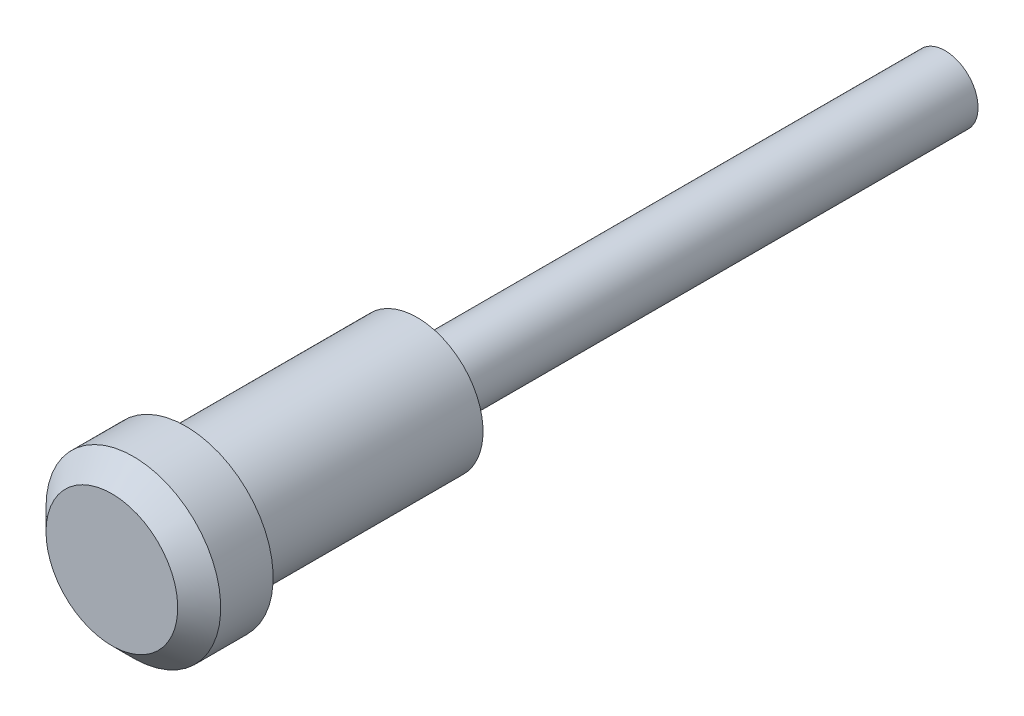
ISO-10303-21;
HEADER;
FILE_DESCRIPTION(('STEP AP214'),'2;1');
FILE_NAME('part.step','',(''),(''),'','','');
FILE_SCHEMA(('AUTOMOTIVE_DESIGN { 1 0 10303 214 1 1 1 1 }'));
ENDSEC;
DATA;
#1=APPLICATION_CONTEXT('core data for automotive mechanical design processes');
#2=APPLICATION_PROTOCOL_DEFINITION('international standard','automotive_design',2000,#1);
#3=PRODUCT_CONTEXT('',#1,'mechanical');
#4=PRODUCT('Part','Part','',(#3));
#5=PRODUCT_RELATED_PRODUCT_CATEGORY('part','',(#4));
#6=PRODUCT_DEFINITION_FORMATION('','',#4);
#7=PRODUCT_DEFINITION_CONTEXT('part definition',#1,'design');
#8=PRODUCT_DEFINITION('design','',#6,#7);
#9=PRODUCT_DEFINITION_SHAPE('','',#8);
#10=(LENGTH_UNIT() NAMED_UNIT(*) SI_UNIT(.MILLI.,.METRE.));
#11=(NAMED_UNIT(*) PLANE_ANGLE_UNIT() SI_UNIT($,.RADIAN.));
#12=(NAMED_UNIT(*) SI_UNIT($,.STERADIAN.) SOLID_ANGLE_UNIT());
#13=UNCERTAINTY_MEASURE_WITH_UNIT(LENGTH_MEASURE(1.E-05),#10,'distance_accuracy_value','');
#14=(GEOMETRIC_REPRESENTATION_CONTEXT(3) GLOBAL_UNCERTAINTY_ASSIGNED_CONTEXT((#13)) GLOBAL_UNIT_ASSIGNED_CONTEXT((#10,
#11,#12)) REPRESENTATION_CONTEXT('',''));
#15=CARTESIAN_POINT('',(0.,0.,0.));
#16=DIRECTION('',(0.,0.,1.));
#17=DIRECTION('',(1.,0.,0.));
#18=AXIS2_PLACEMENT_3D('',#15,#16,#17);
#19=CARTESIAN_POINT('',(0.,3.175,0.));
#20=DIRECTION('',(0.,0.,-1.));
#21=DIRECTION('',(-1.,0.,0.));
#22=AXIS2_PLACEMENT_3D('',#19,#20,#21);
#23=PLANE('',#22);
#24=CARTESIAN_POINT('',(0.,0.,0.));
#25=DIRECTION('',(0.,0.,-1.));
#26=DIRECTION('',(-1.,0.,0.));
#27=AXIS2_PLACEMENT_3D('',#24,#25,#26);
#28=CIRCLE('',#27,6.35);
#29=CARTESIAN_POINT('',(-6.35,0.,0.));
#30=VERTEX_POINT('',#29);
#31=EDGE_CURVE('E10',#30,#30,#28,.T.);
#32=ORIENTED_EDGE('',*,*,#31,.T.);
#33=EDGE_LOOP('',(#32));
#34=FACE_BOUND('',#33,.T.);
#35=CARTESIAN_POINT('',(0.,0.,0.));
#36=DIRECTION('',(0.,0.,-1.));
#37=DIRECTION('',(-1.,0.,0.));
#38=AXIS2_PLACEMENT_3D('',#35,#36,#37);
#39=CIRCLE('',#38,3.175);
#40=CARTESIAN_POINT('',(-3.175,0.,0.));
#41=VERTEX_POINT('',#40);
#42=EDGE_CURVE('E56',#41,#41,#39,.T.);
#43=ORIENTED_EDGE('',*,*,#42,.F.);
#44=EDGE_LOOP('',(#43));
#45=FACE_BOUND('',#44,.T.);
#46=ADVANCED_FACE('F31',(#34,#45),#23,.T.);
#47=CARTESIAN_POINT('',(0.,0.,0.));
#48=DIRECTION('',(0.,0.,-1.));
#49=DIRECTION('',(-1.,0.,0.));
#50=AXIS2_PLACEMENT_3D('',#47,#48,#49);
#51=CYLINDRICAL_SURFACE('',#50,6.35);
#52=CARTESIAN_POINT('',(0.,0.,22.3097990684697));
#53=DIRECTION('',(0.,0.,-1.));
#54=DIRECTION('',(-1.,0.,0.));
#55=AXIS2_PLACEMENT_3D('',#52,#53,#54);
#56=CIRCLE('',#55,6.35);
#57=CARTESIAN_POINT('',(-6.35,0.,22.3097990684697));
#58=VERTEX_POINT('',#57);
#59=EDGE_CURVE('E37',#58,#58,#56,.T.);
#60=ORIENTED_EDGE('',*,*,#59,.T.);
#61=EDGE_LOOP('',(#60));
#62=FACE_BOUND('',#61,.T.);
#63=ORIENTED_EDGE('',*,*,#31,.F.);
#64=EDGE_LOOP('',(#63));
#65=FACE_BOUND('',#64,.T.);
#66=ADVANCED_FACE('F64',(#62,#65),#51,.T.);
#67=CARTESIAN_POINT('',(0.,6.35,22.3097990684697));
#68=DIRECTION('',(0.,0.,-1.));
#69=DIRECTION('',(-1.,0.,0.));
#70=AXIS2_PLACEMENT_3D('',#67,#68,#69);
#71=PLANE('',#70);
#72=CARTESIAN_POINT('',(0.,0.,22.3097990684697));
#73=DIRECTION('',(0.,0.,-1.));
#74=DIRECTION('',(-1.,0.,0.));
#75=AXIS2_PLACEMENT_3D('',#72,#73,#74);
#76=CIRCLE('',#75,8.42346938775511);
#77=CARTESIAN_POINT('',(-8.42346938775511,0.,22.3097990684697));
#78=VERTEX_POINT('',#77);
#79=EDGE_CURVE('E41',#78,#78,#76,.T.);
#80=ORIENTED_EDGE('',*,*,#79,.T.);
#81=EDGE_LOOP('',(#80));
#82=FACE_BOUND('',#81,.T.);
#83=ORIENTED_EDGE('',*,*,#59,.F.);
#84=EDGE_LOOP('',(#83));
#85=FACE_BOUND('',#84,.T.);
#86=ADVANCED_FACE('F68',(#82,#85),#71,.T.);
#87=CARTESIAN_POINT('',(0.,0.,0.));
#88=DIRECTION('',(0.,0.,-1.));
#89=DIRECTION('',(-1.,0.,0.));
#90=AXIS2_PLACEMENT_3D('',#87,#88,#89);
#91=CYLINDRICAL_SURFACE('',#90,8.42346938775511);
#92=CARTESIAN_POINT('',(0.,0.,27.3638807011228));
#93=DIRECTION('',(0.,0.,-1.));
#94=DIRECTION('',(-1.,0.,0.));
#95=AXIS2_PLACEMENT_3D('',#92,#93,#94);
#96=CIRCLE('',#95,8.42346938775511);
#97=CARTESIAN_POINT('',(-8.42346938775511,0.,27.3638807011228));
#98=VERTEX_POINT('',#97);
#99=EDGE_CURVE('E45',#98,#98,#96,.T.);
#100=ORIENTED_EDGE('',*,*,#99,.T.);
#101=EDGE_LOOP('',(#100));
#102=FACE_BOUND('',#101,.T.);
#103=ORIENTED_EDGE('',*,*,#79,.F.);
#104=EDGE_LOOP('',(#103));
#105=FACE_BOUND('',#104,.T.);
#106=ADVANCED_FACE('F72',(#102,#105),#91,.T.);
#107=CARTESIAN_POINT('',(0.,0.,27.3638807011228));
#108=DIRECTION('',(0.,0.,-1.));
#109=DIRECTION('',(-1.,0.,0.));
#110=AXIS2_PLACEMENT_3D('',#107,#108,#109);
#111=CONICAL_SURFACE('',#110,8.42346938775511,0.78539816339745);
#112=CARTESIAN_POINT('',(0.,0.,29.4373500888779));
#113=DIRECTION('',(0.,0.,-1.));
#114=DIRECTION('',(-1.,0.,0.));
#115=AXIS2_PLACEMENT_3D('',#112,#113,#114);
#116=CIRCLE('',#115,6.35);
#117=CARTESIAN_POINT('',(-6.35,0.,29.4373500888779));
#118=VERTEX_POINT('',#117);
#119=EDGE_CURVE('E50',#118,#118,#116,.T.);
#120=ORIENTED_EDGE('',*,*,#119,.T.);
#121=EDGE_LOOP('',(#120));
#122=FACE_BOUND('',#121,.T.);
#123=ORIENTED_EDGE('',*,*,#99,.F.);
#124=EDGE_LOOP('',(#123));
#125=FACE_BOUND('',#124,.T.);
#126=ADVANCED_FACE('F79',(#122,#125),#111,.T.);
#127=CARTESIAN_POINT('',(0.,6.35,29.4373500888783));
#128=DIRECTION('',(0.,0.,1.));
#129=DIRECTION('',(1.,0.,0.));
#130=AXIS2_PLACEMENT_3D('',#127,#128,#129);
#131=PLANE('',#130);
#132=ORIENTED_EDGE('',*,*,#119,.F.);
#133=EDGE_LOOP('',(#132));
#134=FACE_BOUND('',#133,.T.);
#135=ADVANCED_FACE('F83',(#134),#131,.T.);
#136=CARTESIAN_POINT('',(0.,0.,-50.9037048248473));
#137=DIRECTION('',(0.,0.,-1.));
#138=DIRECTION('',(-1.,0.,0.));
#139=AXIS2_PLACEMENT_3D('',#136,#137,#138);
#140=PLANE('',#139);
#141=CARTESIAN_POINT('',(0.,0.,-50.9037048248473));
#142=DIRECTION('',(0.,0.,-1.));
#143=DIRECTION('',(-1.,0.,0.));
#144=AXIS2_PLACEMENT_3D('',#141,#142,#143);
#145=CIRCLE('',#144,3.175);
#146=CARTESIAN_POINT('',(-3.175,0.,-50.9037048248473));
#147=VERTEX_POINT('',#146);
#148=EDGE_CURVE('E53',#147,#147,#145,.T.);
#149=ORIENTED_EDGE('',*,*,#148,.T.);
#150=EDGE_LOOP('',(#149));
#151=FACE_BOUND('',#150,.T.);
#152=ADVANCED_FACE('F87',(#151),#140,.T.);
#153=CARTESIAN_POINT('',(0.,0.,0.));
#154=DIRECTION('',(0.,0.,-1.));
#155=DIRECTION('',(-1.,0.,0.));
#156=AXIS2_PLACEMENT_3D('',#153,#154,#155);
#157=CYLINDRICAL_SURFACE('',#156,3.175);
#158=ORIENTED_EDGE('',*,*,#42,.T.);
#159=EDGE_LOOP('',(#158));
#160=FACE_BOUND('',#159,.T.);
#161=ORIENTED_EDGE('',*,*,#148,.F.);
#162=EDGE_LOOP('',(#161));
#163=FACE_BOUND('',#162,.T.);
#164=ADVANCED_FACE('F60',(#160,#163),#157,.T.);
#165=CLOSED_SHELL('',(#46,#66,#86,#106,#126,#135,#152,#164));
#166=MANIFOLD_SOLID_BREP('B2',#165);
#167=ADVANCED_BREP_SHAPE_REPRESENTATION('',(#18,#166),#14);
#168=SHAPE_DEFINITION_REPRESENTATION(#9,#167);
ENDSEC;
END-ISO-10303-21;
